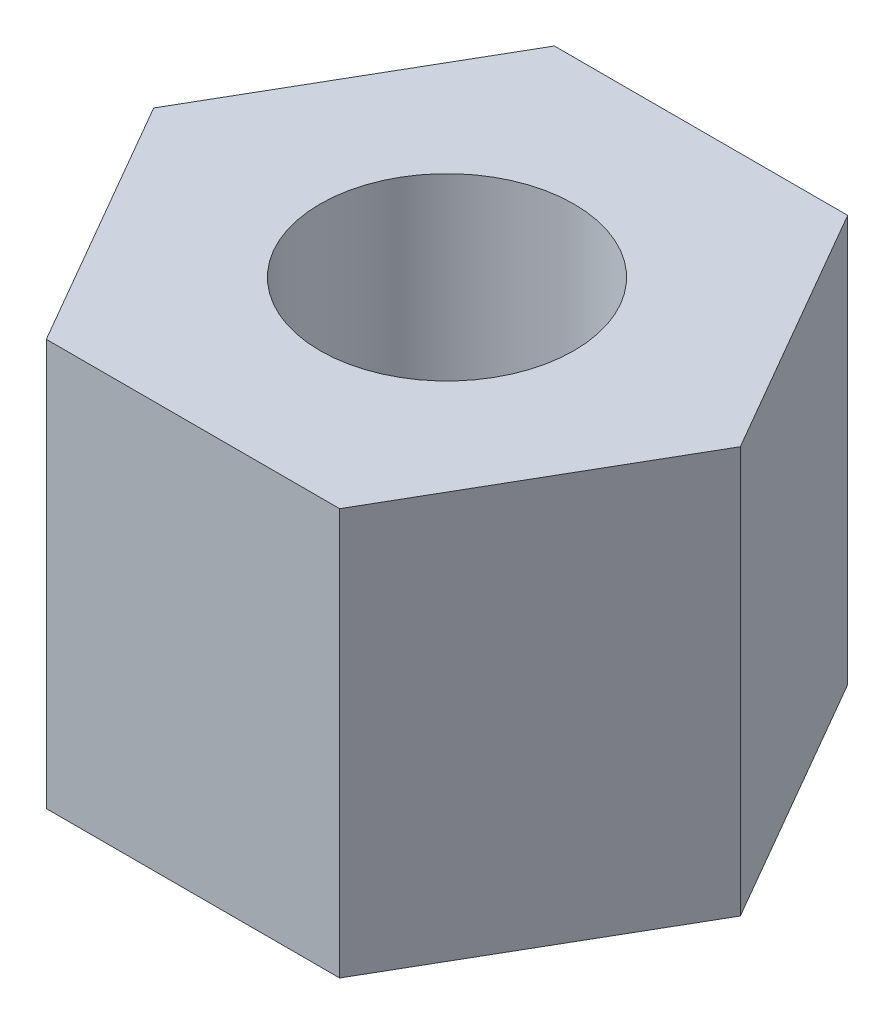
ISO-10303-21;
HEADER;
FILE_DESCRIPTION(('STEP AP214'),'2;1');
FILE_NAME('part.step','',(''),(''),'','','');
FILE_SCHEMA(('AUTOMOTIVE_DESIGN { 1 0 10303 214 1 1 1 1 }'));
ENDSEC;
DATA;
#1=APPLICATION_CONTEXT('core data for automotive mechanical design processes');
#2=APPLICATION_PROTOCOL_DEFINITION('international standard','automotive_design',2000,#1);
#3=PRODUCT_CONTEXT('',#1,'mechanical');
#4=PRODUCT('Part','Part','',(#3));
#5=PRODUCT_RELATED_PRODUCT_CATEGORY('part','',(#4));
#6=PRODUCT_DEFINITION_FORMATION('','',#4);
#7=PRODUCT_DEFINITION_CONTEXT('part definition',#1,'design');
#8=PRODUCT_DEFINITION('design','',#6,#7);
#9=PRODUCT_DEFINITION_SHAPE('','',#8);
#10=(LENGTH_UNIT() NAMED_UNIT(*) SI_UNIT(.MILLI.,.METRE.));
#11=(NAMED_UNIT(*) PLANE_ANGLE_UNIT() SI_UNIT($,.RADIAN.));
#12=(NAMED_UNIT(*) SI_UNIT($,.STERADIAN.) SOLID_ANGLE_UNIT());
#13=UNCERTAINTY_MEASURE_WITH_UNIT(LENGTH_MEASURE(1.E-05),#10,'distance_accuracy_value','');
#14=(GEOMETRIC_REPRESENTATION_CONTEXT(3) GLOBAL_UNCERTAINTY_ASSIGNED_CONTEXT((#13)) GLOBAL_UNIT_ASSIGNED_CONTEXT((#10,
#11,#12)) REPRESENTATION_CONTEXT('',''));
#15=CARTESIAN_POINT('',(0.,0.,0.));
#16=DIRECTION('',(0.,0.,1.));
#17=DIRECTION('',(1.,0.,0.));
#18=AXIS2_PLACEMENT_3D('',#15,#16,#17);
#19=CARTESIAN_POINT('',(0.,4.,0.));
#20=DIRECTION('',(0.,1.,0.));
#21=DIRECTION('',(0.,0.,1.));
#22=AXIS2_PLACEMENT_3D('',#19,#20,#21);
#23=PLANE('',#22);
#24=DIRECTION('',(1.,0.,0.));
#25=VECTOR('',#24,1.);
#26=CARTESIAN_POINT('',(-1.44337567297406,4.,2.5));
#27=LINE('',#26,#25);
#28=CARTESIAN_POINT('',(-1.44337567297406,4.,2.5));
#29=VERTEX_POINT('',#28);
#30=CARTESIAN_POINT('',(1.44337567297406,4.,2.5));
#31=VERTEX_POINT('',#30);
#32=EDGE_CURVE('E134',#29,#31,#27,.T.);
#33=ORIENTED_EDGE('',*,*,#32,.T.);
#34=DIRECTION('',(0.5,0.,-0.866025403784439));
#35=VECTOR('',#34,1.);
#36=CARTESIAN_POINT('',(1.44337567297406,4.,2.5));
#37=LINE('',#36,#35);
#38=CARTESIAN_POINT('',(2.88675134594813,4.,0.));
#39=VERTEX_POINT('',#38);
#40=EDGE_CURVE('E92',#31,#39,#37,.T.);
#41=ORIENTED_EDGE('',*,*,#40,.T.);
#42=DIRECTION('',(-0.5,0.,-0.866025403784438));
#43=VECTOR('',#42,1.);
#44=CARTESIAN_POINT('',(2.88675134594813,4.,0.));
#45=LINE('',#44,#43);
#46=CARTESIAN_POINT('',(1.44337567297406,4.,-2.5));
#47=VERTEX_POINT('',#46);
#48=EDGE_CURVE('E105',#39,#47,#45,.T.);
#49=ORIENTED_EDGE('',*,*,#48,.T.);
#50=DIRECTION('',(-1.,0.,0.));
#51=VECTOR('',#50,1.);
#52=CARTESIAN_POINT('',(1.44337567297406,4.,-2.5));
#53=LINE('',#52,#51);
#54=CARTESIAN_POINT('',(-1.44337567297406,4.,-2.5));
#55=VERTEX_POINT('',#54);
#56=EDGE_CURVE('E99',#47,#55,#53,.T.);
#57=ORIENTED_EDGE('',*,*,#56,.T.);
#58=DIRECTION('',(-0.5,0.,0.866025403784439));
#59=VECTOR('',#58,1.);
#60=CARTESIAN_POINT('',(-1.44337567297406,4.,-2.5));
#61=LINE('',#60,#59);
#62=CARTESIAN_POINT('',(-2.88675134594813,4.,0.));
#63=VERTEX_POINT('',#62);
#64=EDGE_CURVE('E103',#55,#63,#61,.T.);
#65=ORIENTED_EDGE('',*,*,#64,.T.);
#66=DIRECTION('',(0.5,0.,0.866025403784438));
#67=VECTOR('',#66,1.);
#68=CARTESIAN_POINT('',(-2.88675134594813,4.,0.));
#69=LINE('',#68,#67);
#70=EDGE_CURVE('E55',#63,#29,#69,.T.);
#71=ORIENTED_EDGE('',*,*,#70,.T.);
#72=EDGE_LOOP('',(#33,#41,#49,#57,#65,#71));
#73=FACE_BOUND('',#72,.T.);
#74=CARTESIAN_POINT('',(0.,4.,0.));
#75=DIRECTION('',(0.,1.,0.));
#76=DIRECTION('',(0.,0.,1.));
#77=AXIS2_PLACEMENT_3D('',#74,#75,#76);
#78=CIRCLE('',#77,1.25);
#79=CARTESIAN_POINT('',(0.,4.,1.25));
#80=VERTEX_POINT('',#79);
#81=EDGE_CURVE('E127',#80,#80,#78,.T.);
#82=ORIENTED_EDGE('',*,*,#81,.F.);
#83=EDGE_LOOP('',(#82));
#84=FACE_BOUND('',#83,.T.);
#85=ADVANCED_FACE('F38',(#73,#84),#23,.T.);
#86=CARTESIAN_POINT('',(0.,0.,0.));
#87=DIRECTION('',(0.,1.,0.));
#88=DIRECTION('',(0.,0.,1.));
#89=AXIS2_PLACEMENT_3D('',#86,#87,#88);
#90=PLANE('',#89);
#91=DIRECTION('',(1.,0.,0.));
#92=VECTOR('',#91,1.);
#93=CARTESIAN_POINT('',(-1.44337567297406,0.,2.5));
#94=LINE('',#93,#92);
#95=CARTESIAN_POINT('',(-1.44337567297406,0.,2.5));
#96=VERTEX_POINT('',#95);
#97=CARTESIAN_POINT('',(1.44337567297406,0.,2.5));
#98=VERTEX_POINT('',#97);
#99=EDGE_CURVE('E123',#96,#98,#94,.T.);
#100=ORIENTED_EDGE('',*,*,#99,.F.);
#101=DIRECTION('',(0.5,0.,0.866025403784438));
#102=VECTOR('',#101,1.);
#103=CARTESIAN_POINT('',(-2.88675134594813,0.,0.));
#104=LINE('',#103,#102);
#105=CARTESIAN_POINT('',(-2.88675134594813,0.,0.));
#106=VERTEX_POINT('',#105);
#107=EDGE_CURVE('E84',#106,#96,#104,.T.);
#108=ORIENTED_EDGE('',*,*,#107,.F.);
#109=DIRECTION('',(-0.5,0.,0.866025403784439));
#110=VECTOR('',#109,1.);
#111=CARTESIAN_POINT('',(-1.44337567297406,0.,-2.5));
#112=LINE('',#111,#110);
#113=CARTESIAN_POINT('',(-1.44337567297406,0.,-2.5));
#114=VERTEX_POINT('',#113);
#115=EDGE_CURVE('E78',#114,#106,#112,.T.);
#116=ORIENTED_EDGE('',*,*,#115,.F.);
#117=DIRECTION('',(-1.,0.,0.));
#118=VECTOR('',#117,1.);
#119=CARTESIAN_POINT('',(1.44337567297406,0.,-2.5));
#120=LINE('',#119,#118);
#121=CARTESIAN_POINT('',(1.44337567297406,0.,-2.5));
#122=VERTEX_POINT('',#121);
#123=EDGE_CURVE('E113',#122,#114,#120,.T.);
#124=ORIENTED_EDGE('',*,*,#123,.F.);
#125=DIRECTION('',(-0.5,0.,-0.866025403784438));
#126=VECTOR('',#125,1.);
#127=CARTESIAN_POINT('',(2.88675134594813,0.,0.));
#128=LINE('',#127,#126);
#129=CARTESIAN_POINT('',(2.88675134594813,0.,0.));
#130=VERTEX_POINT('',#129);
#131=EDGE_CURVE('E129',#130,#122,#128,.T.);
#132=ORIENTED_EDGE('',*,*,#131,.F.);
#133=DIRECTION('',(0.5,0.,-0.866025403784439));
#134=VECTOR('',#133,1.);
#135=CARTESIAN_POINT('',(1.44337567297406,0.,2.5));
#136=LINE('',#135,#134);
#137=EDGE_CURVE('E126',#98,#130,#136,.T.);
#138=ORIENTED_EDGE('',*,*,#137,.F.);
#139=EDGE_LOOP('',(#100,#108,#116,#124,#132,#138));
#140=FACE_BOUND('',#139,.T.);
#141=CARTESIAN_POINT('',(0.,0.,0.));
#142=DIRECTION('',(0.,1.,0.));
#143=DIRECTION('',(0.,0.,1.));
#144=AXIS2_PLACEMENT_3D('',#141,#142,#143);
#145=CIRCLE('',#144,1.25);
#146=CARTESIAN_POINT('',(0.,0.,1.25));
#147=VERTEX_POINT('',#146);
#148=EDGE_CURVE('E245',#147,#147,#145,.T.);
#149=ORIENTED_EDGE('',*,*,#148,.T.);
#150=EDGE_LOOP('',(#149));
#151=FACE_BOUND('',#150,.T.);
#152=ADVANCED_FACE('F143',(#140,#151),#90,.F.);
#153=CARTESIAN_POINT('',(-1.44337567297406,4.,2.5));
#154=DIRECTION('',(0.,0.,-1.));
#155=DIRECTION('',(-1.,0.,0.));
#156=AXIS2_PLACEMENT_3D('',#153,#154,#155);
#157=PLANE('',#156);
#158=ORIENTED_EDGE('',*,*,#99,.T.);
#159=DIRECTION('',(0.,-1.,0.));
#160=VECTOR('',#159,1.);
#161=CARTESIAN_POINT('',(1.44337567297406,4.,2.5));
#162=LINE('',#161,#160);
#163=EDGE_CURVE('E11',#31,#98,#162,.T.);
#164=ORIENTED_EDGE('',*,*,#163,.F.);
#165=ORIENTED_EDGE('',*,*,#32,.F.);
#166=DIRECTION('',(0.,-1.,0.));
#167=VECTOR('',#166,1.);
#168=CARTESIAN_POINT('',(-1.44337567297406,4.,2.5));
#169=LINE('',#168,#167);
#170=EDGE_CURVE('E119',#29,#96,#169,.T.);
#171=ORIENTED_EDGE('',*,*,#170,.T.);
#172=EDGE_LOOP('',(#158,#164,#165,#171));
#173=FACE_BOUND('',#172,.T.);
#174=ADVANCED_FACE('F40',(#173),#157,.F.);
#175=CARTESIAN_POINT('',(1.44337567297406,4.,2.5));
#176=DIRECTION('',(-0.866025403784439,0.,-0.5));
#177=DIRECTION('',(-0.5,0.,0.866025403784439));
#178=AXIS2_PLACEMENT_3D('',#175,#176,#177);
#179=PLANE('',#178);
#180=ORIENTED_EDGE('',*,*,#137,.T.);
#181=DIRECTION('',(0.,-1.,0.));
#182=VECTOR('',#181,1.);
#183=CARTESIAN_POINT('',(2.88675134594813,4.,0.));
#184=LINE('',#183,#182);
#185=EDGE_CURVE('E47',#39,#130,#184,.T.);
#186=ORIENTED_EDGE('',*,*,#185,.F.);
#187=ORIENTED_EDGE('',*,*,#40,.F.);
#188=ORIENTED_EDGE('',*,*,#163,.T.);
#189=EDGE_LOOP('',(#180,#186,#187,#188));
#190=FACE_BOUND('',#189,.T.);
#191=ADVANCED_FACE('F168',(#190),#179,.F.);
#192=CARTESIAN_POINT('',(2.88675134594813,4.,0.));
#193=DIRECTION('',(-0.866025403784438,0.,0.5));
#194=DIRECTION('',(0.5,0.,0.866025403784438));
#195=AXIS2_PLACEMENT_3D('',#192,#193,#194);
#196=PLANE('',#195);
#197=ORIENTED_EDGE('',*,*,#131,.T.);
#198=DIRECTION('',(0.,-1.,0.));
#199=VECTOR('',#198,1.);
#200=CARTESIAN_POINT('',(1.44337567297406,4.,-2.5));
#201=LINE('',#200,#199);
#202=EDGE_CURVE('E114',#47,#122,#201,.T.);
#203=ORIENTED_EDGE('',*,*,#202,.F.);
#204=ORIENTED_EDGE('',*,*,#48,.F.);
#205=ORIENTED_EDGE('',*,*,#185,.T.);
#206=EDGE_LOOP('',(#197,#203,#204,#205));
#207=FACE_BOUND('',#206,.T.);
#208=ADVANCED_FACE('F140',(#207),#196,.F.);
#209=CARTESIAN_POINT('',(1.44337567297406,4.,-2.5));
#210=DIRECTION('',(0.,0.,1.));
#211=DIRECTION('',(1.,0.,0.));
#212=AXIS2_PLACEMENT_3D('',#209,#210,#211);
#213=PLANE('',#212);
#214=ORIENTED_EDGE('',*,*,#123,.T.);
#215=DIRECTION('',(0.,-1.,0.));
#216=VECTOR('',#215,1.);
#217=CARTESIAN_POINT('',(-1.44337567297406,4.,-2.5));
#218=LINE('',#217,#216);
#219=EDGE_CURVE('E110',#55,#114,#218,.T.);
#220=ORIENTED_EDGE('',*,*,#219,.F.);
#221=ORIENTED_EDGE('',*,*,#56,.F.);
#222=ORIENTED_EDGE('',*,*,#202,.T.);
#223=EDGE_LOOP('',(#214,#220,#221,#222));
#224=FACE_BOUND('',#223,.T.);
#225=ADVANCED_FACE('F111',(#224),#213,.F.);
#226=CARTESIAN_POINT('',(-1.44337567297406,4.,-2.5));
#227=DIRECTION('',(0.866025403784439,0.,0.5));
#228=DIRECTION('',(0.5,0.,-0.866025403784439));
#229=AXIS2_PLACEMENT_3D('',#226,#227,#228);
#230=PLANE('',#229);
#231=ORIENTED_EDGE('',*,*,#115,.T.);
#232=DIRECTION('',(0.,-1.,0.));
#233=VECTOR('',#232,1.);
#234=CARTESIAN_POINT('',(-2.88675134594813,4.,0.));
#235=LINE('',#234,#233);
#236=EDGE_CURVE('E115',#63,#106,#235,.T.);
#237=ORIENTED_EDGE('',*,*,#236,.F.);
#238=ORIENTED_EDGE('',*,*,#64,.F.);
#239=ORIENTED_EDGE('',*,*,#219,.T.);
#240=EDGE_LOOP('',(#231,#237,#238,#239));
#241=FACE_BOUND('',#240,.T.);
#242=ADVANCED_FACE('F117',(#241),#230,.F.);
#243=CARTESIAN_POINT('',(-2.88675134594813,4.,0.));
#244=DIRECTION('',(0.866025403784438,0.,-0.5));
#245=DIRECTION('',(-0.5,0.,-0.866025403784439));
#246=AXIS2_PLACEMENT_3D('',#243,#244,#245);
#247=PLANE('',#246);
#248=ORIENTED_EDGE('',*,*,#107,.T.);
#249=ORIENTED_EDGE('',*,*,#170,.F.);
#250=ORIENTED_EDGE('',*,*,#70,.F.);
#251=ORIENTED_EDGE('',*,*,#236,.T.);
#252=EDGE_LOOP('',(#248,#249,#250,#251));
#253=FACE_BOUND('',#252,.T.);
#254=ADVANCED_FACE('F148',(#253),#247,.F.);
#255=CARTESIAN_POINT('',(0.,4.,0.));
#256=DIRECTION('',(0.,-1.,0.));
#257=DIRECTION('',(0.,0.,-1.));
#258=AXIS2_PLACEMENT_3D('',#255,#256,#257);
#259=CYLINDRICAL_SURFACE('',#258,1.25);
#260=ORIENTED_EDGE('',*,*,#81,.T.);
#261=EDGE_LOOP('',(#260));
#262=FACE_BOUND('',#261,.T.);
#263=ORIENTED_EDGE('',*,*,#148,.F.);
#264=EDGE_LOOP('',(#263));
#265=FACE_BOUND('',#264,.T.);
#266=ADVANCED_FACE('F150',(#262,#265),#259,.F.);
#267=CLOSED_SHELL('',(#85,#152,#174,#191,#208,#225,#242,#254,#266));
#268=MANIFOLD_SOLID_BREP('B2',#267);
#269=ADVANCED_BREP_SHAPE_REPRESENTATION('',(#18,#268),#14);
#270=SHAPE_DEFINITION_REPRESENTATION(#9,#269);
ENDSEC;
END-ISO-10303-21;
